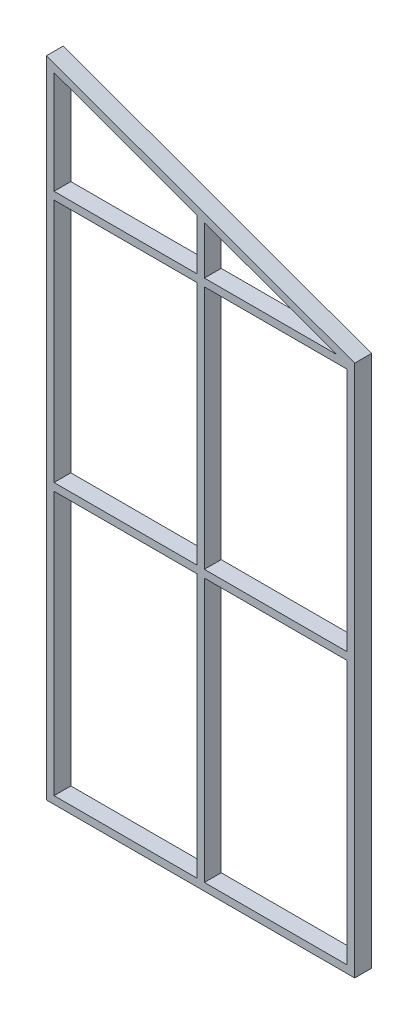
ISO-10303-21;
HEADER;
FILE_DESCRIPTION(('STEP AP214'),'2;1');
FILE_NAME('part.step','',(''),(''),'','','');
FILE_SCHEMA(('AUTOMOTIVE_DESIGN { 1 0 10303 214 1 1 1 1 }'));
ENDSEC;
DATA;
#1=APPLICATION_CONTEXT('core data for automotive mechanical design processes');
#2=APPLICATION_PROTOCOL_DEFINITION('international standard','automotive_design',2000,#1);
#3=PRODUCT_CONTEXT('',#1,'mechanical');
#4=PRODUCT('Part','Part','',(#3));
#5=PRODUCT_RELATED_PRODUCT_CATEGORY('part','',(#4));
#6=PRODUCT_DEFINITION_FORMATION('','',#4);
#7=PRODUCT_DEFINITION_CONTEXT('part definition',#1,'design');
#8=PRODUCT_DEFINITION('design','',#6,#7);
#9=PRODUCT_DEFINITION_SHAPE('','',#8);
#10=(LENGTH_UNIT() NAMED_UNIT(*) SI_UNIT(.MILLI.,.METRE.));
#11=(NAMED_UNIT(*) PLANE_ANGLE_UNIT() SI_UNIT($,.RADIAN.));
#12=(NAMED_UNIT(*) SI_UNIT($,.STERADIAN.) SOLID_ANGLE_UNIT());
#13=UNCERTAINTY_MEASURE_WITH_UNIT(LENGTH_MEASURE(1.E-05),#10,'distance_accuracy_value','');
#14=(GEOMETRIC_REPRESENTATION_CONTEXT(3) GLOBAL_UNCERTAINTY_ASSIGNED_CONTEXT((#13)) GLOBAL_UNIT_ASSIGNED_CONTEXT((#10,
#11,#12)) REPRESENTATION_CONTEXT('',''));
#15=CARTESIAN_POINT('',(0.,0.,0.));
#16=DIRECTION('',(0.,0.,1.));
#17=DIRECTION('',(1.,0.,0.));
#18=AXIS2_PLACEMENT_3D('',#15,#16,#17);
#19=CARTESIAN_POINT('',(27.,2261.45210021914,60.));
#20=DIRECTION('',(1.,0.,0.));
#21=DIRECTION('',(0.,1.,0.));
#22=AXIS2_PLACEMENT_3D('',#19,#20,#21);
#23=PLANE('',#22);
#24=DIRECTION('',(0.,-1.,0.));
#25=VECTOR('',#24,1.);
#26=CARTESIAN_POINT('',(27.,2261.45210021914,0.));
#27=LINE('',#26,#25);
#28=CARTESIAN_POINT('',(27.,1867.58846385551,0.));
#29=VERTEX_POINT('',#28);
#30=CARTESIAN_POINT('',(27.,994.588463855506,0.));
#31=VERTEX_POINT('',#30);
#32=EDGE_CURVE('E407',#29,#31,#27,.T.);
#33=ORIENTED_EDGE('',*,*,#32,.F.);
#34=DIRECTION('',(0.,0.,1.));
#35=VECTOR('',#34,1.);
#36=CARTESIAN_POINT('',(26.9999999999999,1867.58846385551,0.));
#37=LINE('',#36,#35);
#38=CARTESIAN_POINT('',(27.,1867.58846385551,60.));
#39=VERTEX_POINT('',#38);
#40=EDGE_CURVE('E453',#29,#39,#37,.T.);
#41=ORIENTED_EDGE('',*,*,#40,.T.);
#42=DIRECTION('',(0.,-1.,0.));
#43=VECTOR('',#42,1.);
#44=CARTESIAN_POINT('',(27.,2261.45210021914,60.));
#45=LINE('',#44,#43);
#46=CARTESIAN_POINT('',(27.,994.588463855506,60.));
#47=VERTEX_POINT('',#46);
#48=EDGE_CURVE('E104',#39,#47,#45,.T.);
#49=ORIENTED_EDGE('',*,*,#48,.T.);
#50=DIRECTION('',(0.,0.,1.));
#51=VECTOR('',#50,1.);
#52=CARTESIAN_POINT('',(27.,994.588463855506,0.));
#53=LINE('',#52,#51);
#54=EDGE_CURVE('E500',#31,#47,#53,.T.);
#55=ORIENTED_EDGE('',*,*,#54,.F.);
#56=EDGE_LOOP('',(#33,#41,#49,#55));
#57=FACE_BOUND('',#56,.T.);
#58=ADVANCED_FACE('F81',(#57),#23,.T.);
#59=DIRECTION('',(0.,0.,1.));
#60=VECTOR('',#59,1.);
#61=CARTESIAN_POINT('',(26.9999999999999,1894.58846385551,0.));
#62=LINE('',#61,#60);
#63=CARTESIAN_POINT('',(27.,1894.58846385551,0.));
#64=VERTEX_POINT('',#63);
#65=CARTESIAN_POINT('',(26.9999999999999,1894.58846385551,60.));
#66=VERTEX_POINT('',#65);
#67=EDGE_CURVE('E455',#64,#66,#62,.T.);
#68=ORIENTED_EDGE('',*,*,#67,.F.);
#69=CARTESIAN_POINT('',(27.,2261.45210021914,0.));
#70=VERTEX_POINT('',#69);
#71=EDGE_CURVE('E405',#70,#64,#27,.T.);
#72=ORIENTED_EDGE('',*,*,#71,.F.);
#73=DIRECTION('',(0.,0.,-1.));
#74=VECTOR('',#73,1.);
#75=CARTESIAN_POINT('',(27.,2261.45210021914,60.));
#76=LINE('',#75,#74);
#77=CARTESIAN_POINT('',(27.,2261.45210021914,60.));
#78=VERTEX_POINT('',#77);
#79=EDGE_CURVE('E297',#78,#70,#76,.T.);
#80=ORIENTED_EDGE('',*,*,#79,.F.);
#81=EDGE_CURVE('E397',#78,#66,#45,.T.);
#82=ORIENTED_EDGE('',*,*,#81,.T.);
#83=EDGE_LOOP('',(#68,#72,#80,#82));
#84=FACE_BOUND('',#83,.T.);
#85=ADVANCED_FACE('F522',(#84),#23,.T.);
#86=CARTESIAN_POINT('',(27.,27.,60.));
#87=DIRECTION('',(0.,1.,0.));
#88=DIRECTION('',(0.,0.,1.));
#89=AXIS2_PLACEMENT_3D('',#86,#87,#88);
#90=PLANE('',#89);
#91=DIRECTION('',(1.,0.,0.));
#92=VECTOR('',#91,1.);
#93=CARTESIAN_POINT('',(27.,27.,60.));
#94=LINE('',#93,#92);
#95=CARTESIAN_POINT('',(27.,27.,60.));
#96=VERTEX_POINT('',#95);
#97=CARTESIAN_POINT('',(536.5,27.,60.));
#98=VERTEX_POINT('',#97);
#99=EDGE_CURVE('E401',#96,#98,#94,.T.);
#100=ORIENTED_EDGE('',*,*,#99,.T.);
#101=DIRECTION('',(0.,0.,1.));
#102=VECTOR('',#101,1.);
#103=CARTESIAN_POINT('',(536.5,27.,0.));
#104=LINE('',#103,#102);
#105=CARTESIAN_POINT('',(536.5,27.,0.));
#106=VERTEX_POINT('',#105);
#107=EDGE_CURVE('E386',#106,#98,#104,.T.);
#108=ORIENTED_EDGE('',*,*,#107,.F.);
#109=DIRECTION('',(1.,0.,0.));
#110=VECTOR('',#109,1.);
#111=CARTESIAN_POINT('',(27.,27.,0.));
#112=LINE('',#111,#110);
#113=CARTESIAN_POINT('',(27.,27.,0.));
#114=VERTEX_POINT('',#113);
#115=EDGE_CURVE('E293',#114,#106,#112,.T.);
#116=ORIENTED_EDGE('',*,*,#115,.F.);
#117=DIRECTION('',(0.,0.,-1.));
#118=VECTOR('',#117,1.);
#119=CARTESIAN_POINT('',(27.,27.,60.));
#120=LINE('',#119,#118);
#121=EDGE_CURVE('E303',#96,#114,#120,.T.);
#122=ORIENTED_EDGE('',*,*,#121,.F.);
#123=EDGE_LOOP('',(#100,#108,#116,#122));
#124=FACE_BOUND('',#123,.T.);
#125=ADVANCED_FACE('F415',(#124),#90,.T.);
#126=CARTESIAN_POINT('',(1073.,27.,60.));
#127=DIRECTION('',(-1.,0.,0.));
#128=DIRECTION('',(0.,0.,1.));
#129=AXIS2_PLACEMENT_3D('',#126,#127,#128);
#130=PLANE('',#129);
#131=DIRECTION('',(0.,1.,0.));
#132=VECTOR('',#131,1.);
#133=CARTESIAN_POINT('',(1073.,27.,60.));
#134=LINE('',#133,#132);
#135=CARTESIAN_POINT('',(1073.,994.588463855506,60.));
#136=VERTEX_POINT('',#135);
#137=CARTESIAN_POINT('',(1073.,1867.58846385551,60.));
#138=VERTEX_POINT('',#137);
#139=EDGE_CURVE('E403',#136,#138,#134,.T.);
#140=ORIENTED_EDGE('',*,*,#139,.T.);
#141=DIRECTION('',(0.,0.,1.));
#142=VECTOR('',#141,1.);
#143=CARTESIAN_POINT('',(1073.,1867.58846385551,0.));
#144=LINE('',#143,#142);
#145=CARTESIAN_POINT('',(1073.,1867.58846385551,0.));
#146=VERTEX_POINT('',#145);
#147=EDGE_CURVE('E449',#146,#138,#144,.T.);
#148=ORIENTED_EDGE('',*,*,#147,.F.);
#149=DIRECTION('',(0.,1.,0.));
#150=VECTOR('',#149,1.);
#151=CARTESIAN_POINT('',(1073.,27.,0.));
#152=LINE('',#151,#150);
#153=CARTESIAN_POINT('',(1073.,994.588463855506,0.));
#154=VERTEX_POINT('',#153);
#155=EDGE_CURVE('E288',#154,#146,#152,.T.);
#156=ORIENTED_EDGE('',*,*,#155,.F.);
#157=DIRECTION('',(0.,0.,1.));
#158=VECTOR('',#157,1.);
#159=CARTESIAN_POINT('',(1073.,994.588463855506,0.));
#160=LINE('',#159,#158);
#161=EDGE_CURVE('E281',#154,#136,#160,.T.);
#162=ORIENTED_EDGE('',*,*,#161,.T.);
#163=EDGE_LOOP('',(#140,#148,#156,#162));
#164=FACE_BOUND('',#163,.T.);
#165=ADVANCED_FACE('F518',(#164),#130,.T.);
#166=CARTESIAN_POINT('',(1073.,1881.08846385551,60.));
#167=DIRECTION('',(-0.341743063086705,-0.939793423488437,0.));
#168=DIRECTION('',(0.939793423488437,-0.341743063086705,0.));
#169=AXIS2_PLACEMENT_3D('',#166,#167,#168);
#170=PLANE('',#169);
#171=DIRECTION('',(-0.939793423488437,0.341743063086705,0.));
#172=VECTOR('',#171,1.);
#173=CARTESIAN_POINT('',(1073.,1881.08846385551,0.));
#174=LINE('',#173,#172);
#175=CARTESIAN_POINT('',(536.5,2076.17937294641,0.));
#176=VERTEX_POINT('',#175);
#177=EDGE_CURVE('E287',#176,#70,#174,.T.);
#178=ORIENTED_EDGE('',*,*,#177,.F.);
#179=DIRECTION('',(0.,0.,1.));
#180=VECTOR('',#179,1.);
#181=CARTESIAN_POINT('',(536.5,2076.17937294641,60.));
#182=LINE('',#181,#180);
#183=CARTESIAN_POINT('',(536.5,2076.17937294641,60.));
#184=VERTEX_POINT('',#183);
#185=EDGE_CURVE('E89',#176,#184,#182,.T.);
#186=ORIENTED_EDGE('',*,*,#185,.T.);
#187=DIRECTION('',(-0.939793423488437,0.341743063086705,0.));
#188=VECTOR('',#187,1.);
#189=CARTESIAN_POINT('',(1073.,1881.08846385551,60.));
#190=LINE('',#189,#188);
#191=EDGE_CURVE('E343',#184,#78,#190,.T.);
#192=ORIENTED_EDGE('',*,*,#191,.T.);
#193=ORIENTED_EDGE('',*,*,#79,.T.);
#194=EDGE_LOOP('',(#178,#186,#192,#193));
#195=FACE_BOUND('',#194,.T.);
#196=ADVANCED_FACE('F342',(#195),#170,.T.);
#197=CARTESIAN_POINT('',(0.,0.,60.));
#198=DIRECTION('',(0.,0.,1.));
#199=DIRECTION('',(1.,0.,0.));
#200=AXIS2_PLACEMENT_3D('',#197,#198,#199);
#201=PLANE('',#200);
#202=DIRECTION('',(0.,1.,0.));
#203=VECTOR('',#202,1.);
#204=CARTESIAN_POINT('',(563.5,27.,60.));
#205=LINE('',#204,#203);
#206=CARTESIAN_POINT('',(563.5,1894.58846385551,60.));
#207=VERTEX_POINT('',#206);
#208=CARTESIAN_POINT('',(563.5,2066.36119112823,60.));
#209=VERTEX_POINT('',#208);
#210=EDGE_CURVE('E362',#207,#209,#205,.T.);
#211=ORIENTED_EDGE('',*,*,#210,.T.);
#212=CARTESIAN_POINT('',(1035.875,1894.58846385551,60.));
#213=VERTEX_POINT('',#212);
#214=EDGE_CURVE('E301',#213,#209,#190,.T.);
#215=ORIENTED_EDGE('',*,*,#214,.F.);
#216=DIRECTION('',(-1.,0.,0.));
#217=VECTOR('',#216,1.);
#218=CARTESIAN_POINT('',(1073.,1894.58846385551,60.));
#219=LINE('',#218,#217);
#220=EDGE_CURVE('E432',#213,#207,#219,.T.);
#221=ORIENTED_EDGE('',*,*,#220,.T.);
#222=EDGE_LOOP('',(#211,#215,#221));
#223=FACE_BOUND('',#222,.T.);
#224=ORIENTED_EDGE('',*,*,#191,.F.);
#225=DIRECTION('',(0.,1.,0.));
#226=VECTOR('',#225,1.);
#227=CARTESIAN_POINT('',(536.5,27.,60.));
#228=LINE('',#227,#226);
#229=CARTESIAN_POINT('',(536.5,1894.58846385551,60.));
#230=VERTEX_POINT('',#229);
#231=EDGE_CURVE('E348',#230,#184,#228,.T.);
#232=ORIENTED_EDGE('',*,*,#231,.F.);
#233=EDGE_CURVE('E438',#230,#66,#219,.T.);
#234=ORIENTED_EDGE('',*,*,#233,.T.);
#235=ORIENTED_EDGE('',*,*,#81,.F.);
#236=EDGE_LOOP('',(#224,#232,#234,#235));
#237=FACE_BOUND('',#236,.T.);
#238=DIRECTION('',(1.,0.,0.));
#239=VECTOR('',#238,1.);
#240=CARTESIAN_POINT('',(27.,994.588463855506,60.));
#241=LINE('',#240,#239);
#242=CARTESIAN_POINT('',(536.5,994.588463855506,60.));
#243=VERTEX_POINT('',#242);
#244=EDGE_CURVE('E272',#47,#243,#241,.T.);
#245=ORIENTED_EDGE('',*,*,#244,.F.);
#246=ORIENTED_EDGE('',*,*,#48,.F.);
#247=DIRECTION('',(-1.,0.,0.));
#248=VECTOR('',#247,1.);
#249=CARTESIAN_POINT('',(1073.,1867.58846385551,60.));
#250=LINE('',#249,#248);
#251=CARTESIAN_POINT('',(536.5,1867.58846385551,60.));
#252=VERTEX_POINT('',#251);
#253=EDGE_CURVE('E437',#252,#39,#250,.T.);
#254=ORIENTED_EDGE('',*,*,#253,.F.);
#255=EDGE_CURVE('E355',#243,#252,#228,.T.);
#256=ORIENTED_EDGE('',*,*,#255,.F.);
#257=EDGE_LOOP('',(#245,#246,#254,#256));
#258=FACE_BOUND('',#257,.T.);
#259=CARTESIAN_POINT('',(536.5,967.588463855506,60.));
#260=VERTEX_POINT('',#259);
#261=EDGE_CURVE('E358',#98,#260,#228,.T.);
#262=ORIENTED_EDGE('',*,*,#261,.F.);
#263=ORIENTED_EDGE('',*,*,#99,.F.);
#264=CARTESIAN_POINT('',(27.,967.588463855506,60.));
#265=VERTEX_POINT('',#264);
#266=EDGE_CURVE('E400',#265,#96,#45,.T.);
#267=ORIENTED_EDGE('',*,*,#266,.F.);
#268=DIRECTION('',(1.,0.,0.));
#269=VECTOR('',#268,1.);
#270=CARTESIAN_POINT('',(27.,967.588463855506,60.));
#271=LINE('',#270,#269);
#272=EDGE_CURVE('E505',#265,#260,#271,.T.);
#273=ORIENTED_EDGE('',*,*,#272,.T.);
#274=EDGE_LOOP('',(#262,#263,#267,#273));
#275=FACE_BOUND('',#274,.T.);
#276=CARTESIAN_POINT('',(563.5,1867.58846385551,60.));
#277=VERTEX_POINT('',#276);
#278=EDGE_CURVE('E441',#138,#277,#250,.T.);
#279=ORIENTED_EDGE('',*,*,#278,.F.);
#280=ORIENTED_EDGE('',*,*,#139,.F.);
#281=CARTESIAN_POINT('',(563.5,994.588463855506,60.));
#282=VERTEX_POINT('',#281);
#283=EDGE_CURVE('E469',#282,#136,#241,.T.);
#284=ORIENTED_EDGE('',*,*,#283,.F.);
#285=EDGE_CURVE('E360',#282,#277,#205,.T.);
#286=ORIENTED_EDGE('',*,*,#285,.T.);
#287=EDGE_LOOP('',(#279,#280,#284,#286));
#288=FACE_BOUND('',#287,.T.);
#289=CARTESIAN_POINT('',(563.5,27.,60.));
#290=VERTEX_POINT('',#289);
#291=CARTESIAN_POINT('',(1073.,27.,60.));
#292=VERTEX_POINT('',#291);
#293=EDGE_CURVE('E399',#290,#292,#94,.T.);
#294=ORIENTED_EDGE('',*,*,#293,.F.);
#295=CARTESIAN_POINT('',(563.5,967.588463855506,60.));
#296=VERTEX_POINT('',#295);
#297=EDGE_CURVE('E356',#290,#296,#205,.T.);
#298=ORIENTED_EDGE('',*,*,#297,.T.);
#299=CARTESIAN_POINT('',(1073.,967.588463855506,60.));
#300=VERTEX_POINT('',#299);
#301=EDGE_CURVE('E507',#296,#300,#271,.T.);
#302=ORIENTED_EDGE('',*,*,#301,.T.);
#303=EDGE_CURVE('E280',#292,#300,#134,.T.);
#304=ORIENTED_EDGE('',*,*,#303,.F.);
#305=EDGE_LOOP('',(#294,#298,#302,#304));
#306=FACE_BOUND('',#305,.T.);
#307=DIRECTION('',(0.,-1.,0.));
#308=VECTOR('',#307,1.);
#309=CARTESIAN_POINT('',(0.,2300.,60.));
#310=LINE('',#309,#308);
#311=CARTESIAN_POINT('',(0.,2300.,60.));
#312=VERTEX_POINT('',#311);
#313=CARTESIAN_POINT('',(0.,0.,60.));
#314=VERTEX_POINT('',#313);
#315=EDGE_CURVE('E307',#312,#314,#310,.T.);
#316=ORIENTED_EDGE('',*,*,#315,.T.);
#317=DIRECTION('',(1.,0.,0.));
#318=VECTOR('',#317,1.);
#319=CARTESIAN_POINT('',(0.,0.,60.));
#320=LINE('',#319,#318);
#321=CARTESIAN_POINT('',(1100.,0.,60.));
#322=VERTEX_POINT('',#321);
#323=EDGE_CURVE('E310',#314,#322,#320,.T.);
#324=ORIENTED_EDGE('',*,*,#323,.T.);
#325=DIRECTION('',(0.,1.,0.));
#326=VECTOR('',#325,1.);
#327=CARTESIAN_POINT('',(1100.,0.,60.));
#328=LINE('',#327,#326);
#329=CARTESIAN_POINT('',(1100.,1900.,60.));
#330=VERTEX_POINT('',#329);
#331=EDGE_CURVE('E313',#322,#330,#328,.T.);
#332=ORIENTED_EDGE('',*,*,#331,.T.);
#333=DIRECTION('',(-0.939793423488437,0.341743063086704,0.));
#334=VECTOR('',#333,1.);
#335=CARTESIAN_POINT('',(1100.,1900.,60.));
#336=LINE('',#335,#334);
#337=EDGE_CURVE('E315',#330,#312,#336,.T.);
#338=ORIENTED_EDGE('',*,*,#337,.T.);
#339=EDGE_LOOP('',(#316,#324,#332,#338));
#340=FACE_BOUND('',#339,.T.);
#341=ADVANCED_FACE('F466',(#223,#237,#258,#275,#288,#306,#340),#201,.T.);
#342=CARTESIAN_POINT('',(0.,0.,0.));
#343=DIRECTION('',(0.,0.,1.));
#344=DIRECTION('',(1.,0.,0.));
#345=AXIS2_PLACEMENT_3D('',#342,#343,#344);
#346=PLANE('',#345);
#347=CARTESIAN_POINT('',(1035.875,1894.58846385551,0.));
#348=VERTEX_POINT('',#347);
#349=CARTESIAN_POINT('',(563.5,2066.36119112823,0.));
#350=VERTEX_POINT('',#349);
#351=EDGE_CURVE('E290',#348,#350,#174,.T.);
#352=ORIENTED_EDGE('',*,*,#351,.T.);
#353=DIRECTION('',(0.,1.,0.));
#354=VECTOR('',#353,1.);
#355=CARTESIAN_POINT('',(563.5,27.,0.));
#356=LINE('',#355,#354);
#357=CARTESIAN_POINT('',(563.5,1894.58846385551,0.));
#358=VERTEX_POINT('',#357);
#359=EDGE_CURVE('E364',#358,#350,#356,.T.);
#360=ORIENTED_EDGE('',*,*,#359,.F.);
#361=DIRECTION('',(-1.,0.,0.));
#362=VECTOR('',#361,1.);
#363=CARTESIAN_POINT('',(1073.,1894.58846385551,0.));
#364=LINE('',#363,#362);
#365=EDGE_CURVE('E424',#348,#358,#364,.T.);
#366=ORIENTED_EDGE('',*,*,#365,.F.);
#367=EDGE_LOOP('',(#352,#360,#366));
#368=FACE_BOUND('',#367,.T.);
#369=DIRECTION('',(0.,1.,0.));
#370=VECTOR('',#369,1.);
#371=CARTESIAN_POINT('',(536.5,27.,0.));
#372=LINE('',#371,#370);
#373=CARTESIAN_POINT('',(536.5,1894.58846385551,0.));
#374=VERTEX_POINT('',#373);
#375=EDGE_CURVE('E378',#374,#176,#372,.T.);
#376=ORIENTED_EDGE('',*,*,#375,.T.);
#377=ORIENTED_EDGE('',*,*,#177,.T.);
#378=ORIENTED_EDGE('',*,*,#71,.T.);
#379=EDGE_CURVE('E448',#374,#64,#364,.T.);
#380=ORIENTED_EDGE('',*,*,#379,.F.);
#381=EDGE_LOOP('',(#376,#377,#378,#380));
#382=FACE_BOUND('',#381,.T.);
#383=ORIENTED_EDGE('',*,*,#32,.T.);
#384=DIRECTION('',(1.,0.,0.));
#385=VECTOR('',#384,1.);
#386=CARTESIAN_POINT('',(27.,994.588463855506,0.));
#387=LINE('',#386,#385);
#388=CARTESIAN_POINT('',(536.5,994.588463855506,0.));
#389=VERTEX_POINT('',#388);
#390=EDGE_CURVE('E282',#31,#389,#387,.T.);
#391=ORIENTED_EDGE('',*,*,#390,.T.);
#392=CARTESIAN_POINT('',(536.5,1867.58846385551,0.));
#393=VERTEX_POINT('',#392);
#394=EDGE_CURVE('E381',#389,#393,#372,.T.);
#395=ORIENTED_EDGE('',*,*,#394,.T.);
#396=DIRECTION('',(-1.,0.,0.));
#397=VECTOR('',#396,1.);
#398=CARTESIAN_POINT('',(1073.,1867.58846385551,0.));
#399=LINE('',#398,#397);
#400=EDGE_CURVE('E485',#393,#29,#399,.T.);
#401=ORIENTED_EDGE('',*,*,#400,.T.);
#402=EDGE_LOOP('',(#383,#391,#395,#401));
#403=FACE_BOUND('',#402,.T.);
#404=ORIENTED_EDGE('',*,*,#115,.T.);
#405=CARTESIAN_POINT('',(536.5,967.588463855506,0.));
#406=VERTEX_POINT('',#405);
#407=EDGE_CURVE('E382',#106,#406,#372,.T.);
#408=ORIENTED_EDGE('',*,*,#407,.T.);
#409=DIRECTION('',(1.,0.,0.));
#410=VECTOR('',#409,1.);
#411=CARTESIAN_POINT('',(27.,967.588463855506,0.));
#412=LINE('',#411,#410);
#413=CARTESIAN_POINT('',(27.,967.588463855506,0.));
#414=VERTEX_POINT('',#413);
#415=EDGE_CURVE('E271',#414,#406,#412,.T.);
#416=ORIENTED_EDGE('',*,*,#415,.F.);
#417=EDGE_CURVE('E395',#414,#114,#27,.T.);
#418=ORIENTED_EDGE('',*,*,#417,.T.);
#419=EDGE_LOOP('',(#404,#408,#416,#418));
#420=FACE_BOUND('',#419,.T.);
#421=ORIENTED_EDGE('',*,*,#155,.T.);
#422=CARTESIAN_POINT('',(563.5,1867.58846385551,0.));
#423=VERTEX_POINT('',#422);
#424=EDGE_CURVE('E444',#146,#423,#399,.T.);
#425=ORIENTED_EDGE('',*,*,#424,.T.);
#426=CARTESIAN_POINT('',(563.5,994.588463855506,0.));
#427=VERTEX_POINT('',#426);
#428=EDGE_CURVE('E370',#427,#423,#356,.T.);
#429=ORIENTED_EDGE('',*,*,#428,.F.);
#430=EDGE_CURVE('E482',#427,#154,#387,.T.);
#431=ORIENTED_EDGE('',*,*,#430,.T.);
#432=EDGE_LOOP('',(#421,#425,#429,#431));
#433=FACE_BOUND('',#432,.T.);
#434=DIRECTION('',(0.,-1.,0.));
#435=VECTOR('',#434,1.);
#436=CARTESIAN_POINT('',(0.,2300.,0.));
#437=LINE('',#436,#435);
#438=CARTESIAN_POINT('',(0.,2300.,0.));
#439=VERTEX_POINT('',#438);
#440=CARTESIAN_POINT('',(0.,0.,0.));
#441=VERTEX_POINT('',#440);
#442=EDGE_CURVE('E306',#439,#441,#437,.T.);
#443=ORIENTED_EDGE('',*,*,#442,.F.);
#444=DIRECTION('',(-0.939793423488437,0.341743063086704,0.));
#445=VECTOR('',#444,1.);
#446=CARTESIAN_POINT('',(1100.,1900.,0.));
#447=LINE('',#446,#445);
#448=CARTESIAN_POINT('',(1100.,1900.,0.));
#449=VERTEX_POINT('',#448);
#450=EDGE_CURVE('E311',#449,#439,#447,.T.);
#451=ORIENTED_EDGE('',*,*,#450,.F.);
#452=DIRECTION('',(0.,1.,0.));
#453=VECTOR('',#452,1.);
#454=CARTESIAN_POINT('',(1100.,0.,0.));
#455=LINE('',#454,#453);
#456=CARTESIAN_POINT('',(1100.,0.,0.));
#457=VERTEX_POINT('',#456);
#458=EDGE_CURVE('E322',#457,#449,#455,.T.);
#459=ORIENTED_EDGE('',*,*,#458,.F.);
#460=DIRECTION('',(1.,0.,0.));
#461=VECTOR('',#460,1.);
#462=CARTESIAN_POINT('',(0.,0.,0.));
#463=LINE('',#462,#461);
#464=EDGE_CURVE('E320',#441,#457,#463,.T.);
#465=ORIENTED_EDGE('',*,*,#464,.F.);
#466=EDGE_LOOP('',(#443,#451,#459,#465));
#467=FACE_BOUND('',#466,.T.);
#468=CARTESIAN_POINT('',(563.5,27.,0.));
#469=VERTEX_POINT('',#468);
#470=CARTESIAN_POINT('',(563.5,967.588463855506,0.));
#471=VERTEX_POINT('',#470);
#472=EDGE_CURVE('E372',#469,#471,#356,.T.);
#473=ORIENTED_EDGE('',*,*,#472,.F.);
#474=CARTESIAN_POINT('',(1073.,27.,0.));
#475=VERTEX_POINT('',#474);
#476=EDGE_CURVE('E285',#469,#475,#112,.T.);
#477=ORIENTED_EDGE('',*,*,#476,.T.);
#478=CARTESIAN_POINT('',(1073.,967.588463855506,0.));
#479=VERTEX_POINT('',#478);
#480=EDGE_CURVE('E278',#475,#479,#152,.T.);
#481=ORIENTED_EDGE('',*,*,#480,.T.);
#482=EDGE_CURVE('E260',#471,#479,#412,.T.);
#483=ORIENTED_EDGE('',*,*,#482,.F.);
#484=EDGE_LOOP('',(#473,#477,#481,#483));
#485=FACE_BOUND('',#484,.T.);
#486=ADVANCED_FACE('F284',(#368,#382,#403,#420,#433,#467,#485),#346,.F.);
#487=CARTESIAN_POINT('',(0.,2300.,60.));
#488=DIRECTION('',(1.,0.,0.));
#489=DIRECTION('',(0.,1.,0.));
#490=AXIS2_PLACEMENT_3D('',#487,#488,#489);
#491=PLANE('',#490);
#492=ORIENTED_EDGE('',*,*,#442,.T.);
#493=DIRECTION('',(0.,0.,-1.));
#494=VECTOR('',#493,1.);
#495=CARTESIAN_POINT('',(0.,0.,60.));
#496=LINE('',#495,#494);
#497=EDGE_CURVE('E333',#314,#441,#496,.T.);
#498=ORIENTED_EDGE('',*,*,#497,.F.);
#499=ORIENTED_EDGE('',*,*,#315,.F.);
#500=DIRECTION('',(0.,0.,-1.));
#501=VECTOR('',#500,1.);
#502=CARTESIAN_POINT('',(0.,2300.,60.));
#503=LINE('',#502,#501);
#504=EDGE_CURVE('E317',#312,#439,#503,.T.);
#505=ORIENTED_EDGE('',*,*,#504,.T.);
#506=EDGE_LOOP('',(#492,#498,#499,#505));
#507=FACE_BOUND('',#506,.T.);
#508=ADVANCED_FACE('F83',(#507),#491,.F.);
#509=CARTESIAN_POINT('',(0.,0.,60.));
#510=DIRECTION('',(0.,1.,0.));
#511=DIRECTION('',(0.,0.,1.));
#512=AXIS2_PLACEMENT_3D('',#509,#510,#511);
#513=PLANE('',#512);
#514=ORIENTED_EDGE('',*,*,#464,.T.);
#515=DIRECTION('',(0.,0.,-1.));
#516=VECTOR('',#515,1.);
#517=CARTESIAN_POINT('',(1100.,0.,60.));
#518=LINE('',#517,#516);
#519=EDGE_CURVE('E330',#322,#457,#518,.T.);
#520=ORIENTED_EDGE('',*,*,#519,.F.);
#521=ORIENTED_EDGE('',*,*,#323,.F.);
#522=ORIENTED_EDGE('',*,*,#497,.T.);
#523=EDGE_LOOP('',(#514,#520,#521,#522));
#524=FACE_BOUND('',#523,.T.);
#525=ADVANCED_FACE('F542',(#524),#513,.F.);
#526=CARTESIAN_POINT('',(1100.,0.,60.));
#527=DIRECTION('',(-1.,0.,0.));
#528=DIRECTION('',(0.,0.,1.));
#529=AXIS2_PLACEMENT_3D('',#526,#527,#528);
#530=PLANE('',#529);
#531=ORIENTED_EDGE('',*,*,#458,.T.);
#532=DIRECTION('',(0.,0.,-1.));
#533=VECTOR('',#532,1.);
#534=CARTESIAN_POINT('',(1100.,1900.,60.));
#535=LINE('',#534,#533);
#536=EDGE_CURVE('E327',#330,#449,#535,.T.);
#537=ORIENTED_EDGE('',*,*,#536,.F.);
#538=ORIENTED_EDGE('',*,*,#331,.F.);
#539=ORIENTED_EDGE('',*,*,#519,.T.);
#540=EDGE_LOOP('',(#531,#537,#538,#539));
#541=FACE_BOUND('',#540,.T.);
#542=ADVANCED_FACE('F536',(#541),#530,.F.);
#543=CARTESIAN_POINT('',(1100.,1900.,60.));
#544=DIRECTION('',(-0.341743063086704,-0.939793423488437,0.));
#545=DIRECTION('',(0.939793423488437,-0.341743063086704,0.));
#546=AXIS2_PLACEMENT_3D('',#543,#544,#545);
#547=PLANE('',#546);
#548=ORIENTED_EDGE('',*,*,#450,.T.);
#549=ORIENTED_EDGE('',*,*,#504,.F.);
#550=ORIENTED_EDGE('',*,*,#337,.F.);
#551=ORIENTED_EDGE('',*,*,#536,.T.);
#552=EDGE_LOOP('',(#548,#549,#550,#551));
#553=FACE_BOUND('',#552,.T.);
#554=ADVANCED_FACE('F530',(#553),#547,.F.);
#555=DIRECTION('',(0.,0.,1.));
#556=VECTOR('',#555,1.);
#557=CARTESIAN_POINT('',(27.,967.588463855506,0.));
#558=LINE('',#557,#556);
#559=EDGE_CURVE('E96',#414,#265,#558,.T.);
#560=ORIENTED_EDGE('',*,*,#559,.T.);
#561=ORIENTED_EDGE('',*,*,#266,.T.);
#562=ORIENTED_EDGE('',*,*,#121,.T.);
#563=ORIENTED_EDGE('',*,*,#417,.F.);
#564=EDGE_LOOP('',(#560,#561,#562,#563));
#565=FACE_BOUND('',#564,.T.);
#566=ADVANCED_FACE('F417',(#565),#23,.T.);
#567=DIRECTION('',(0.,0.,1.));
#568=VECTOR('',#567,1.);
#569=CARTESIAN_POINT('',(563.5,27.,0.));
#570=LINE('',#569,#568);
#571=EDGE_CURVE('E392',#469,#290,#570,.T.);
#572=ORIENTED_EDGE('',*,*,#571,.T.);
#573=ORIENTED_EDGE('',*,*,#293,.T.);
#574=DIRECTION('',(0.,0.,-1.));
#575=VECTOR('',#574,1.);
#576=CARTESIAN_POINT('',(1073.,27.,60.));
#577=LINE('',#576,#575);
#578=EDGE_CURVE('E300',#292,#475,#577,.T.);
#579=ORIENTED_EDGE('',*,*,#578,.T.);
#580=ORIENTED_EDGE('',*,*,#476,.F.);
#581=EDGE_LOOP('',(#572,#573,#579,#580));
#582=FACE_BOUND('',#581,.T.);
#583=ADVANCED_FACE('F529',(#582),#90,.T.);
#584=DIRECTION('',(0.,0.,1.));
#585=VECTOR('',#584,1.);
#586=CARTESIAN_POINT('',(1073.,967.588463855506,0.));
#587=LINE('',#586,#585);
#588=EDGE_CURVE('E263',#479,#300,#587,.T.);
#589=ORIENTED_EDGE('',*,*,#588,.F.);
#590=ORIENTED_EDGE('',*,*,#480,.F.);
#591=ORIENTED_EDGE('',*,*,#578,.F.);
#592=ORIENTED_EDGE('',*,*,#303,.T.);
#593=EDGE_LOOP('',(#589,#590,#591,#592));
#594=FACE_BOUND('',#593,.T.);
#595=ADVANCED_FACE('F276',(#594),#130,.T.);
#596=DIRECTION('',(0.,0.,1.));
#597=VECTOR('',#596,1.);
#598=CARTESIAN_POINT('',(563.5,2066.36119112823,60.));
#599=LINE('',#598,#597);
#600=EDGE_CURVE('E12',#350,#209,#599,.T.);
#601=ORIENTED_EDGE('',*,*,#600,.F.);
#602=ORIENTED_EDGE('',*,*,#351,.F.);
#603=DIRECTION('',(0.,0.,-1.));
#604=VECTOR('',#603,1.);
#605=CARTESIAN_POINT('',(1035.875,1894.58846385551,60.));
#606=LINE('',#605,#604);
#607=EDGE_CURVE('E336',#213,#348,#606,.T.);
#608=ORIENTED_EDGE('',*,*,#607,.F.);
#609=ORIENTED_EDGE('',*,*,#214,.T.);
#610=EDGE_LOOP('',(#601,#602,#608,#609));
#611=FACE_BOUND('',#610,.T.);
#612=ADVANCED_FACE('F426',(#611),#170,.T.);
#613=CARTESIAN_POINT('',(563.5,27.,0.));
#614=DIRECTION('',(1.,0.,0.));
#615=DIRECTION('',(0.,0.,-1.));
#616=AXIS2_PLACEMENT_3D('',#613,#614,#615);
#617=PLANE('',#616);
#618=ORIENTED_EDGE('',*,*,#285,.F.);
#619=DIRECTION('',(0.,0.,-1.));
#620=VECTOR('',#619,1.);
#621=CARTESIAN_POINT('',(563.5,994.588463855506,0.));
#622=LINE('',#621,#620);
#623=EDGE_CURVE('E480',#282,#427,#622,.T.);
#624=ORIENTED_EDGE('',*,*,#623,.T.);
#625=ORIENTED_EDGE('',*,*,#428,.T.);
#626=DIRECTION('',(0.,0.,1.));
#627=VECTOR('',#626,1.);
#628=CARTESIAN_POINT('',(563.5,1867.58846385551,0.));
#629=LINE('',#628,#627);
#630=EDGE_CURVE('E460',#423,#277,#629,.T.);
#631=ORIENTED_EDGE('',*,*,#630,.T.);
#632=EDGE_LOOP('',(#618,#624,#625,#631));
#633=FACE_BOUND('',#632,.T.);
#634=ADVANCED_FACE('F478',(#633),#617,.T.);
#635=CARTESIAN_POINT('',(536.5,27.,0.));
#636=DIRECTION('',(1.,0.,0.));
#637=DIRECTION('',(0.,0.,-1.));
#638=AXIS2_PLACEMENT_3D('',#635,#636,#637);
#639=PLANE('',#638);
#640=DIRECTION('',(0.,0.,-1.));
#641=VECTOR('',#640,1.);
#642=CARTESIAN_POINT('',(536.5,994.588463855506,0.));
#643=LINE('',#642,#641);
#644=EDGE_CURVE('E495',#243,#389,#643,.T.);
#645=ORIENTED_EDGE('',*,*,#644,.F.);
#646=ORIENTED_EDGE('',*,*,#255,.T.);
#647=DIRECTION('',(0.,0.,1.));
#648=VECTOR('',#647,1.);
#649=CARTESIAN_POINT('',(536.5,1867.58846385551,0.));
#650=LINE('',#649,#648);
#651=EDGE_CURVE('E452',#393,#252,#650,.T.);
#652=ORIENTED_EDGE('',*,*,#651,.F.);
#653=ORIENTED_EDGE('',*,*,#394,.F.);
#654=EDGE_LOOP('',(#645,#646,#652,#653));
#655=FACE_BOUND('',#654,.T.);
#656=ADVANCED_FACE('F608',(#655),#639,.F.);
#657=DIRECTION('',(0.,0.,-1.));
#658=VECTOR('',#657,1.);
#659=CARTESIAN_POINT('',(563.5,967.588463855506,0.));
#660=LINE('',#659,#658);
#661=EDGE_CURVE('E266',#296,#471,#660,.T.);
#662=ORIENTED_EDGE('',*,*,#661,.F.);
#663=ORIENTED_EDGE('',*,*,#297,.F.);
#664=ORIENTED_EDGE('',*,*,#571,.F.);
#665=ORIENTED_EDGE('',*,*,#472,.T.);
#666=EDGE_LOOP('',(#662,#663,#664,#665));
#667=FACE_BOUND('',#666,.T.);
#668=ADVANCED_FACE('F610',(#667),#617,.T.);
#669=ORIENTED_EDGE('',*,*,#261,.T.);
#670=DIRECTION('',(0.,0.,-1.));
#671=VECTOR('',#670,1.);
#672=CARTESIAN_POINT('',(536.5,967.588463855506,0.));
#673=LINE('',#672,#671);
#674=EDGE_CURVE('E492',#260,#406,#673,.T.);
#675=ORIENTED_EDGE('',*,*,#674,.T.);
#676=ORIENTED_EDGE('',*,*,#407,.F.);
#677=ORIENTED_EDGE('',*,*,#107,.T.);
#678=EDGE_LOOP('',(#669,#675,#676,#677));
#679=FACE_BOUND('',#678,.T.);
#680=ADVANCED_FACE('F621',(#679),#639,.F.);
#681=ORIENTED_EDGE('',*,*,#359,.T.);
#682=ORIENTED_EDGE('',*,*,#600,.T.);
#683=ORIENTED_EDGE('',*,*,#210,.F.);
#684=DIRECTION('',(0.,0.,1.));
#685=VECTOR('',#684,1.);
#686=CARTESIAN_POINT('',(563.5,1894.58846385551,0.));
#687=LINE('',#686,#685);
#688=EDGE_CURVE('E433',#358,#207,#687,.T.);
#689=ORIENTED_EDGE('',*,*,#688,.F.);
#690=EDGE_LOOP('',(#681,#682,#683,#689));
#691=FACE_BOUND('',#690,.T.);
#692=ADVANCED_FACE('F611',(#691),#617,.T.);
#693=ORIENTED_EDGE('',*,*,#185,.F.);
#694=ORIENTED_EDGE('',*,*,#375,.F.);
#695=DIRECTION('',(0.,0.,1.));
#696=VECTOR('',#695,1.);
#697=CARTESIAN_POINT('',(536.5,1894.58846385551,0.));
#698=LINE('',#697,#696);
#699=EDGE_CURVE('E351',#374,#230,#698,.T.);
#700=ORIENTED_EDGE('',*,*,#699,.T.);
#701=ORIENTED_EDGE('',*,*,#231,.T.);
#702=EDGE_LOOP('',(#693,#694,#700,#701));
#703=FACE_BOUND('',#702,.T.);
#704=ADVANCED_FACE('F349',(#703),#639,.F.);
#705=CARTESIAN_POINT('',(1073.,1867.58846385551,0.));
#706=DIRECTION('',(0.,1.,0.));
#707=DIRECTION('',(-1.,0.,0.));
#708=AXIS2_PLACEMENT_3D('',#705,#706,#707);
#709=PLANE('',#708);
#710=ORIENTED_EDGE('',*,*,#400,.F.);
#711=ORIENTED_EDGE('',*,*,#651,.T.);
#712=ORIENTED_EDGE('',*,*,#253,.T.);
#713=ORIENTED_EDGE('',*,*,#40,.F.);
#714=EDGE_LOOP('',(#710,#711,#712,#713));
#715=FACE_BOUND('',#714,.T.);
#716=ADVANCED_FACE('F650',(#715),#709,.F.);
#717=CARTESIAN_POINT('',(1073.,1894.58846385551,0.));
#718=DIRECTION('',(0.,1.,0.));
#719=DIRECTION('',(-1.,0.,0.));
#720=AXIS2_PLACEMENT_3D('',#717,#718,#719);
#721=PLANE('',#720);
#722=ORIENTED_EDGE('',*,*,#699,.F.);
#723=ORIENTED_EDGE('',*,*,#379,.T.);
#724=ORIENTED_EDGE('',*,*,#67,.T.);
#725=ORIENTED_EDGE('',*,*,#233,.F.);
#726=EDGE_LOOP('',(#722,#723,#724,#725));
#727=FACE_BOUND('',#726,.T.);
#728=ADVANCED_FACE('F658',(#727),#721,.T.);
#729=ORIENTED_EDGE('',*,*,#220,.F.);
#730=ORIENTED_EDGE('',*,*,#607,.T.);
#731=ORIENTED_EDGE('',*,*,#365,.T.);
#732=ORIENTED_EDGE('',*,*,#688,.T.);
#733=EDGE_LOOP('',(#729,#730,#731,#732));
#734=FACE_BOUND('',#733,.T.);
#735=ADVANCED_FACE('F430',(#734),#721,.T.);
#736=ORIENTED_EDGE('',*,*,#630,.F.);
#737=ORIENTED_EDGE('',*,*,#424,.F.);
#738=ORIENTED_EDGE('',*,*,#147,.T.);
#739=ORIENTED_EDGE('',*,*,#278,.T.);
#740=EDGE_LOOP('',(#736,#737,#738,#739));
#741=FACE_BOUND('',#740,.T.);
#742=ADVANCED_FACE('F475',(#741),#709,.F.);
#743=CARTESIAN_POINT('',(27.,994.588463855506,0.));
#744=DIRECTION('',(0.,-1.,0.));
#745=DIRECTION('',(0.,0.,-1.));
#746=AXIS2_PLACEMENT_3D('',#743,#744,#745);
#747=PLANE('',#746);
#748=ORIENTED_EDGE('',*,*,#244,.T.);
#749=ORIENTED_EDGE('',*,*,#644,.T.);
#750=ORIENTED_EDGE('',*,*,#390,.F.);
#751=ORIENTED_EDGE('',*,*,#54,.T.);
#752=EDGE_LOOP('',(#748,#749,#750,#751));
#753=FACE_BOUND('',#752,.T.);
#754=ADVANCED_FACE('F684',(#753),#747,.F.);
#755=CARTESIAN_POINT('',(27.,967.588463855506,0.));
#756=DIRECTION('',(0.,-1.,0.));
#757=DIRECTION('',(0.,0.,-1.));
#758=AXIS2_PLACEMENT_3D('',#755,#756,#757);
#759=PLANE('',#758);
#760=ORIENTED_EDGE('',*,*,#674,.F.);
#761=ORIENTED_EDGE('',*,*,#272,.F.);
#762=ORIENTED_EDGE('',*,*,#559,.F.);
#763=ORIENTED_EDGE('',*,*,#415,.T.);
#764=EDGE_LOOP('',(#760,#761,#762,#763));
#765=FACE_BOUND('',#764,.T.);
#766=ADVANCED_FACE('F510',(#765),#759,.T.);
#767=ORIENTED_EDGE('',*,*,#301,.F.);
#768=ORIENTED_EDGE('',*,*,#661,.T.);
#769=ORIENTED_EDGE('',*,*,#482,.T.);
#770=ORIENTED_EDGE('',*,*,#588,.T.);
#771=EDGE_LOOP('',(#767,#768,#769,#770));
#772=FACE_BOUND('',#771,.T.);
#773=ADVANCED_FACE('F262',(#772),#759,.T.);
#774=ORIENTED_EDGE('',*,*,#623,.F.);
#775=ORIENTED_EDGE('',*,*,#283,.T.);
#776=ORIENTED_EDGE('',*,*,#161,.F.);
#777=ORIENTED_EDGE('',*,*,#430,.F.);
#778=EDGE_LOOP('',(#774,#775,#776,#777));
#779=FACE_BOUND('',#778,.T.);
#780=ADVANCED_FACE('F694',(#779),#747,.F.);
#781=CLOSED_SHELL('',(#58,#85,#125,#165,#196,#341,#486,#508,#525,#542,#554,#566,#583,#595,#612,
#634,#656,#668,#680,#692,#704,#716,#728,#735,#742,#754,#766,#773,#780));
#782=MANIFOLD_SOLID_BREP('B2',#781);
#783=ADVANCED_BREP_SHAPE_REPRESENTATION('',(#18,#782),#14);
#784=SHAPE_DEFINITION_REPRESENTATION(#9,#783);
ENDSEC;
END-ISO-10303-21;
